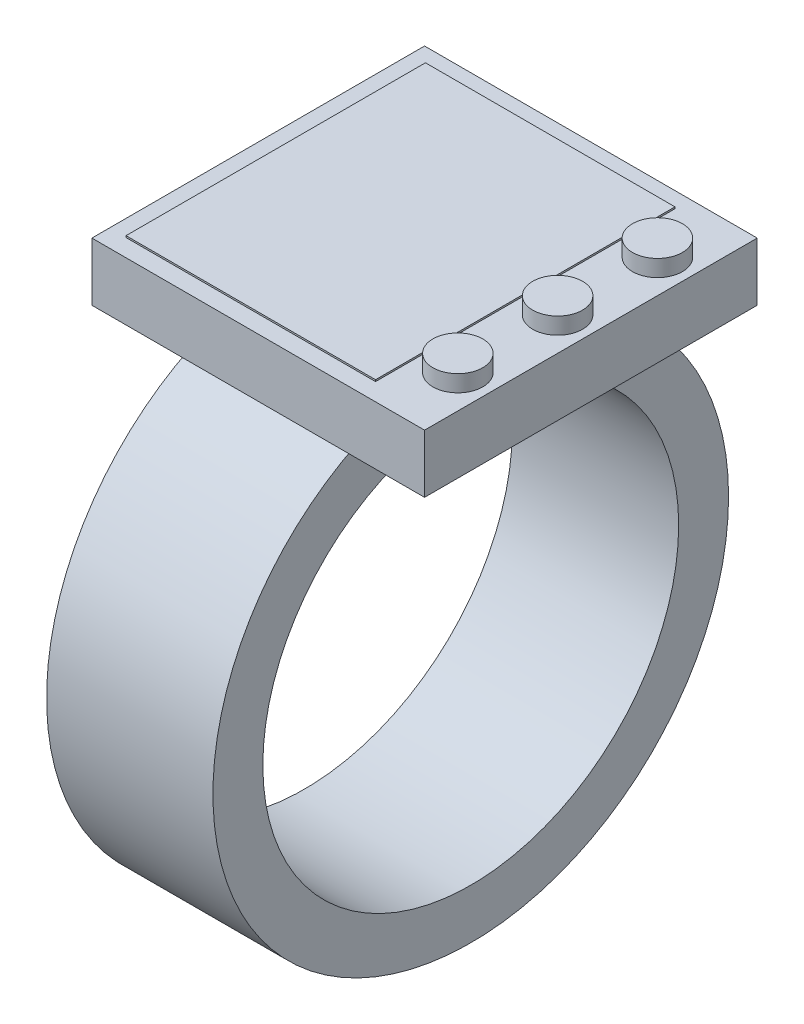
ISO-10303-21;
HEADER;
FILE_DESCRIPTION(('STEP AP214'),'2;1');
FILE_NAME('part.step','',(''),(''),'','','');
FILE_SCHEMA(('AUTOMOTIVE_DESIGN { 1 0 10303 214 1 1 1 1 }'));
ENDSEC;
DATA;
#1=APPLICATION_CONTEXT('core data for automotive mechanical design processes');
#2=APPLICATION_PROTOCOL_DEFINITION('international standard','automotive_design',2000,#1);
#3=PRODUCT_CONTEXT('',#1,'mechanical');
#4=PRODUCT('Part','Part','',(#3));
#5=PRODUCT_RELATED_PRODUCT_CATEGORY('part','',(#4));
#6=PRODUCT_DEFINITION_FORMATION('','',#4);
#7=PRODUCT_DEFINITION_CONTEXT('part definition',#1,'design');
#8=PRODUCT_DEFINITION('design','',#6,#7);
#9=PRODUCT_DEFINITION_SHAPE('','',#8);
#10=(LENGTH_UNIT() NAMED_UNIT(*) SI_UNIT(.MILLI.,.METRE.));
#11=(NAMED_UNIT(*) PLANE_ANGLE_UNIT() SI_UNIT($,.RADIAN.));
#12=(NAMED_UNIT(*) SI_UNIT($,.STERADIAN.) SOLID_ANGLE_UNIT());
#13=UNCERTAINTY_MEASURE_WITH_UNIT(LENGTH_MEASURE(1.E-05),#10,'distance_accuracy_value','');
#14=(GEOMETRIC_REPRESENTATION_CONTEXT(3) GLOBAL_UNCERTAINTY_ASSIGNED_CONTEXT((#13)) GLOBAL_UNIT_ASSIGNED_CONTEXT((#10,
#11,#12)) REPRESENTATION_CONTEXT('',''));
#15=CARTESIAN_POINT('',(0.,0.,0.));
#16=DIRECTION('',(0.,0.,1.));
#17=DIRECTION('',(1.,0.,0.));
#18=AXIS2_PLACEMENT_3D('',#15,#16,#17);
#19=CARTESIAN_POINT('',(-9.10458595575782,48.26,-27.4501922158795));
#20=DIRECTION('',(1.,0.,0.));
#21=DIRECTION('',(0.,0.,-1.));
#22=AXIS2_PLACEMENT_3D('',#19,#20,#21);
#23=PLANE('',#22);
#24=DIRECTION('',(0.,0.,1.));
#25=VECTOR('',#24,1.);
#26=CARTESIAN_POINT('',(-9.10458595575782,39.37,-27.4501922158795));
#27=LINE('',#26,#25);
#28=CARTESIAN_POINT('',(-9.10458595575782,39.37,-27.4501922158795));
#29=VERTEX_POINT('',#28);
#30=CARTESIAN_POINT('',(-9.10458595575782,39.37,23.3498077841205));
#31=VERTEX_POINT('',#30);
#32=EDGE_CURVE('E150',#29,#31,#27,.T.);
#33=ORIENTED_EDGE('',*,*,#32,.T.);
#34=DIRECTION('',(0.,-1.,0.));
#35=VECTOR('',#34,1.);
#36=CARTESIAN_POINT('',(-9.10458595575782,48.26,23.3498077841205));
#37=LINE('',#36,#35);
#38=CARTESIAN_POINT('',(-9.10458595575782,48.26,23.3498077841205));
#39=VERTEX_POINT('',#38);
#40=EDGE_CURVE('E12',#39,#31,#37,.T.);
#41=ORIENTED_EDGE('',*,*,#40,.F.);
#42=DIRECTION('',(0.,0.,1.));
#43=VECTOR('',#42,1.);
#44=CARTESIAN_POINT('',(-9.10458595575782,48.26,-27.4501922158795));
#45=LINE('',#44,#43);
#46=CARTESIAN_POINT('',(-9.10458595575782,48.26,-27.4501922158795));
#47=VERTEX_POINT('',#46);
#48=EDGE_CURVE('E173',#47,#39,#45,.T.);
#49=ORIENTED_EDGE('',*,*,#48,.F.);
#50=DIRECTION('',(0.,-1.,0.));
#51=VECTOR('',#50,1.);
#52=CARTESIAN_POINT('',(-9.10458595575782,48.26,-27.4501922158795));
#53=LINE('',#52,#51);
#54=EDGE_CURVE('E179',#47,#29,#53,.T.);
#55=ORIENTED_EDGE('',*,*,#54,.T.);
#56=EDGE_LOOP('',(#33,#41,#49,#55));
#57=FACE_BOUND('',#56,.T.);
#58=ADVANCED_FACE('F59',(#57),#23,.F.);
#59=CARTESIAN_POINT('',(-9.10458595575782,48.26,23.3498077841205));
#60=DIRECTION('',(0.,0.,-1.));
#61=DIRECTION('',(-1.,0.,0.));
#62=AXIS2_PLACEMENT_3D('',#59,#60,#61);
#63=PLANE('',#62);
#64=DIRECTION('',(1.,0.,0.));
#65=VECTOR('',#64,1.);
#66=CARTESIAN_POINT('',(-9.10458595575782,39.37,23.3498077841205));
#67=LINE('',#66,#65);
#68=CARTESIAN_POINT('',(41.6954140442422,39.37,23.3498077841205));
#69=VERTEX_POINT('',#68);
#70=EDGE_CURVE('E182',#31,#69,#67,.T.);
#71=ORIENTED_EDGE('',*,*,#70,.T.);
#72=DIRECTION('',(0.,-1.,0.));
#73=VECTOR('',#72,1.);
#74=CARTESIAN_POINT('',(41.6954140442422,48.26,23.3498077841205));
#75=LINE('',#74,#73);
#76=CARTESIAN_POINT('',(41.6954140442422,48.26,23.3498077841205));
#77=VERTEX_POINT('',#76);
#78=EDGE_CURVE('E66',#77,#69,#75,.T.);
#79=ORIENTED_EDGE('',*,*,#78,.F.);
#80=DIRECTION('',(1.,0.,0.));
#81=VECTOR('',#80,1.);
#82=CARTESIAN_POINT('',(-9.10458595575782,48.26,23.3498077841205));
#83=LINE('',#82,#81);
#84=EDGE_CURVE('E110',#39,#77,#83,.T.);
#85=ORIENTED_EDGE('',*,*,#84,.F.);
#86=ORIENTED_EDGE('',*,*,#40,.T.);
#87=EDGE_LOOP('',(#71,#79,#85,#86));
#88=FACE_BOUND('',#87,.T.);
#89=ADVANCED_FACE('F212',(#88),#63,.F.);
#90=CARTESIAN_POINT('',(41.6954140442422,48.26,-27.4501922158795));
#91=DIRECTION('',(-1.,0.,0.));
#92=DIRECTION('',(0.,0.,1.));
#93=AXIS2_PLACEMENT_3D('',#90,#91,#92);
#94=PLANE('',#93);
#95=DIRECTION('',(0.,0.,-1.));
#96=VECTOR('',#95,1.);
#97=CARTESIAN_POINT('',(41.6954140442422,39.37,-27.4501922158795));
#98=LINE('',#97,#96);
#99=CARTESIAN_POINT('',(41.6954140442422,39.37,-27.4501922158795));
#100=VERTEX_POINT('',#99);
#101=EDGE_CURVE('E184',#69,#100,#98,.T.);
#102=ORIENTED_EDGE('',*,*,#101,.T.);
#103=DIRECTION('',(0.,-1.,0.));
#104=VECTOR('',#103,1.);
#105=CARTESIAN_POINT('',(41.6954140442422,48.26,-27.4501922158795));
#106=LINE('',#105,#104);
#107=CARTESIAN_POINT('',(41.6954140442422,48.26,-27.4501922158795));
#108=VERTEX_POINT('',#107);
#109=EDGE_CURVE('E188',#108,#100,#106,.T.);
#110=ORIENTED_EDGE('',*,*,#109,.F.);
#111=DIRECTION('',(0.,0.,-1.));
#112=VECTOR('',#111,1.);
#113=CARTESIAN_POINT('',(41.6954140442422,48.26,-27.4501922158795));
#114=LINE('',#113,#112);
#115=EDGE_CURVE('E176',#77,#108,#114,.T.);
#116=ORIENTED_EDGE('',*,*,#115,.F.);
#117=ORIENTED_EDGE('',*,*,#78,.T.);
#118=EDGE_LOOP('',(#102,#110,#116,#117));
#119=FACE_BOUND('',#118,.T.);
#120=ADVANCED_FACE('F193',(#119),#94,.F.);
#121=CARTESIAN_POINT('',(-9.10458595575782,48.26,-27.4501922158795));
#122=DIRECTION('',(0.,0.,1.));
#123=DIRECTION('',(1.,0.,0.));
#124=AXIS2_PLACEMENT_3D('',#121,#122,#123);
#125=PLANE('',#124);
#126=DIRECTION('',(-1.,0.,0.));
#127=VECTOR('',#126,1.);
#128=CARTESIAN_POINT('',(-9.10458595575782,39.37,-27.4501922158795));
#129=LINE('',#128,#127);
#130=EDGE_CURVE('E103',#100,#29,#129,.T.);
#131=ORIENTED_EDGE('',*,*,#130,.T.);
#132=ORIENTED_EDGE('',*,*,#54,.F.);
#133=DIRECTION('',(-1.,0.,0.));
#134=VECTOR('',#133,1.);
#135=CARTESIAN_POINT('',(-9.10458595575782,48.26,-27.4501922158795));
#136=LINE('',#135,#134);
#137=EDGE_CURVE('E82',#108,#47,#136,.T.);
#138=ORIENTED_EDGE('',*,*,#137,.F.);
#139=ORIENTED_EDGE('',*,*,#109,.T.);
#140=EDGE_LOOP('',(#131,#132,#138,#139));
#141=FACE_BOUND('',#140,.T.);
#142=ADVANCED_FACE('F201',(#141),#125,.F.);
#143=CARTESIAN_POINT('',(0.,48.26,0.));
#144=DIRECTION('',(0.,1.,0.));
#145=DIRECTION('',(0.,0.,1.));
#146=AXIS2_PLACEMENT_3D('',#143,#144,#145);
#147=PLANE('',#146);
#148=CARTESIAN_POINT('',(36.6154140442422,48.26,-17.2901922158795));
#149=DIRECTION('',(0.,1.,0.));
#150=DIRECTION('',(0.,0.,1.));
#151=AXIS2_PLACEMENT_3D('',#148,#149,#150);
#152=CIRCLE('',#151,3.81);
#153=CARTESIAN_POINT('',(36.6154140442422,48.26,-13.4801922158795));
#154=VERTEX_POINT('',#153);
#155=EDGE_CURVE('E394',#154,#154,#152,.T.);
#156=ORIENTED_EDGE('',*,*,#155,.F.);
#157=EDGE_LOOP('',(#156));
#158=FACE_BOUND('',#157,.T.);
#159=CARTESIAN_POINT('',(36.6154140442422,48.26,13.1898077841205));
#160=DIRECTION('',(0.,1.,0.));
#161=DIRECTION('',(0.,0.,1.));
#162=AXIS2_PLACEMENT_3D('',#159,#160,#161);
#163=CIRCLE('',#162,3.81);
#164=CARTESIAN_POINT('',(36.6154140442422,48.26,16.9998077841205));
#165=VERTEX_POINT('',#164);
#166=EDGE_CURVE('E397',#165,#165,#163,.T.);
#167=ORIENTED_EDGE('',*,*,#166,.F.);
#168=EDGE_LOOP('',(#167));
#169=FACE_BOUND('',#168,.T.);
#170=CARTESIAN_POINT('',(36.6154140442422,48.26,-2.05019221587949));
#171=DIRECTION('',(0.,1.,0.));
#172=DIRECTION('',(0.,0.,1.));
#173=AXIS2_PLACEMENT_3D('',#170,#171,#172);
#174=CIRCLE('',#173,3.81);
#175=CARTESIAN_POINT('',(36.6154140442422,48.26,1.75980778412051));
#176=VERTEX_POINT('',#175);
#177=EDGE_CURVE('E405',#176,#176,#174,.T.);
#178=ORIENTED_EDGE('',*,*,#177,.F.);
#179=EDGE_LOOP('',(#178));
#180=FACE_BOUND('',#179,.T.);
#181=DIRECTION('',(1.,0.,0.));
#182=VECTOR('',#181,1.);
#183=CARTESIAN_POINT('',(-6.56458595575782,48.26,20.6754647037333));
#184=LINE('',#183,#182);
#185=CARTESIAN_POINT('',(-6.56458595575782,48.26,20.6754647037333));
#186=VERTEX_POINT('',#185);
#187=CARTESIAN_POINT('',(31.5354140442422,48.26,20.6754647037333));
#188=VERTEX_POINT('',#187);
#189=EDGE_CURVE('E73',#186,#188,#184,.T.);
#190=ORIENTED_EDGE('',*,*,#189,.F.);
#191=DIRECTION('',(0.,0.,1.));
#192=VECTOR('',#191,1.);
#193=CARTESIAN_POINT('',(-6.56458595575782,48.26,-25.0445352962667));
#194=LINE('',#193,#192);
#195=CARTESIAN_POINT('',(-6.56458595575782,48.26,-25.0445352962667));
#196=VERTEX_POINT('',#195);
#197=EDGE_CURVE('E143',#196,#186,#194,.T.);
#198=ORIENTED_EDGE('',*,*,#197,.F.);
#199=DIRECTION('',(1.,0.,0.));
#200=VECTOR('',#199,1.);
#201=CARTESIAN_POINT('',(-6.56458595575782,48.26,-25.0445352962667));
#202=LINE('',#201,#200);
#203=CARTESIAN_POINT('',(31.5354140442422,48.26,-25.0445352962667));
#204=VERTEX_POINT('',#203);
#205=EDGE_CURVE('E165',#196,#204,#202,.T.);
#206=ORIENTED_EDGE('',*,*,#205,.T.);
#207=DIRECTION('',(0.,0.,1.));
#208=VECTOR('',#207,1.);
#209=CARTESIAN_POINT('',(31.5354140442422,48.26,-25.0445352962667));
#210=LINE('',#209,#208);
#211=EDGE_CURVE('E162',#204,#188,#210,.T.);
#212=ORIENTED_EDGE('',*,*,#211,.T.);
#213=EDGE_LOOP('',(#190,#198,#206,#212));
#214=FACE_BOUND('',#213,.T.);
#215=ORIENTED_EDGE('',*,*,#48,.T.);
#216=ORIENTED_EDGE('',*,*,#84,.T.);
#217=ORIENTED_EDGE('',*,*,#115,.T.);
#218=ORIENTED_EDGE('',*,*,#137,.T.);
#219=EDGE_LOOP('',(#215,#216,#217,#218));
#220=FACE_BOUND('',#219,.T.);
#221=ADVANCED_FACE('F203',(#158,#169,#180,#214,#220),#147,.T.);
#222=CARTESIAN_POINT('',(0.,39.37,0.));
#223=DIRECTION('',(0.,1.,0.));
#224=DIRECTION('',(0.,0.,1.));
#225=AXIS2_PLACEMENT_3D('',#222,#223,#224);
#226=PLANE('',#225);
#227=ORIENTED_EDGE('',*,*,#32,.F.);
#228=ORIENTED_EDGE('',*,*,#130,.F.);
#229=ORIENTED_EDGE('',*,*,#101,.F.);
#230=ORIENTED_EDGE('',*,*,#70,.F.);
#231=EDGE_LOOP('',(#227,#228,#229,#230));
#232=FACE_BOUND('',#231,.T.);
#233=ADVANCED_FACE('F197',(#232),#226,.F.);
#234=CARTESIAN_POINT('',(-6.56458595575782,48.514,20.6754647037333));
#235=DIRECTION('',(0.,0.,-1.));
#236=DIRECTION('',(-1.,0.,0.));
#237=AXIS2_PLACEMENT_3D('',#234,#235,#236);
#238=PLANE('',#237);
#239=ORIENTED_EDGE('',*,*,#189,.T.);
#240=DIRECTION('',(0.,-1.,0.));
#241=VECTOR('',#240,1.);
#242=CARTESIAN_POINT('',(31.5354140442422,48.514,20.6754647037333));
#243=LINE('',#242,#241);
#244=CARTESIAN_POINT('',(31.5354140442422,48.514,20.6754647037333));
#245=VERTEX_POINT('',#244);
#246=EDGE_CURVE('E145',#245,#188,#243,.T.);
#247=ORIENTED_EDGE('',*,*,#246,.F.);
#248=DIRECTION('',(1.,0.,0.));
#249=VECTOR('',#248,1.);
#250=CARTESIAN_POINT('',(-6.56458595575782,48.514,20.6754647037333));
#251=LINE('',#250,#249);
#252=CARTESIAN_POINT('',(-6.56458595575782,48.514,20.6754647037333));
#253=VERTEX_POINT('',#252);
#254=EDGE_CURVE('E134',#253,#245,#251,.T.);
#255=ORIENTED_EDGE('',*,*,#254,.F.);
#256=DIRECTION('',(0.,-1.,0.));
#257=VECTOR('',#256,1.);
#258=CARTESIAN_POINT('',(-6.56458595575782,48.514,20.6754647037333));
#259=LINE('',#258,#257);
#260=EDGE_CURVE('E160',#253,#186,#259,.T.);
#261=ORIENTED_EDGE('',*,*,#260,.T.);
#262=EDGE_LOOP('',(#239,#247,#255,#261));
#263=FACE_BOUND('',#262,.T.);
#264=ADVANCED_FACE('F146',(#263),#238,.F.);
#265=CARTESIAN_POINT('',(31.5354140442422,48.514,-25.0445352962667));
#266=DIRECTION('',(1.,0.,0.));
#267=DIRECTION('',(0.,0.,-1.));
#268=AXIS2_PLACEMENT_3D('',#265,#266,#267);
#269=PLANE('',#268);
#270=ORIENTED_EDGE('',*,*,#211,.F.);
#271=DIRECTION('',(0.,-1.,0.));
#272=VECTOR('',#271,1.);
#273=CARTESIAN_POINT('',(31.5354140442422,48.514,-25.0445352962667));
#274=LINE('',#273,#272);
#275=CARTESIAN_POINT('',(31.5354140442422,48.514,-25.0445352962667));
#276=VERTEX_POINT('',#275);
#277=EDGE_CURVE('E151',#276,#204,#274,.T.);
#278=ORIENTED_EDGE('',*,*,#277,.F.);
#279=DIRECTION('',(0.,0.,1.));
#280=VECTOR('',#279,1.);
#281=CARTESIAN_POINT('',(31.5354140442422,48.514,-25.0445352962667));
#282=LINE('',#281,#280);
#283=EDGE_CURVE('E138',#276,#245,#282,.T.);
#284=ORIENTED_EDGE('',*,*,#283,.T.);
#285=ORIENTED_EDGE('',*,*,#246,.T.);
#286=EDGE_LOOP('',(#270,#278,#284,#285));
#287=FACE_BOUND('',#286,.T.);
#288=ADVANCED_FACE('F153',(#287),#269,.T.);
#289=CARTESIAN_POINT('',(-6.56458595575782,48.514,-25.0445352962667));
#290=DIRECTION('',(0.,0.,-1.));
#291=DIRECTION('',(-1.,0.,0.));
#292=AXIS2_PLACEMENT_3D('',#289,#290,#291);
#293=PLANE('',#292);
#294=ORIENTED_EDGE('',*,*,#205,.F.);
#295=DIRECTION('',(0.,-1.,0.));
#296=VECTOR('',#295,1.);
#297=CARTESIAN_POINT('',(-6.56458595575782,48.514,-25.0445352962667));
#298=LINE('',#297,#296);
#299=CARTESIAN_POINT('',(-6.56458595575782,48.514,-25.0445352962667));
#300=VERTEX_POINT('',#299);
#301=EDGE_CURVE('E170',#300,#196,#298,.T.);
#302=ORIENTED_EDGE('',*,*,#301,.F.);
#303=DIRECTION('',(1.,0.,0.));
#304=VECTOR('',#303,1.);
#305=CARTESIAN_POINT('',(-6.56458595575782,48.514,-25.0445352962667));
#306=LINE('',#305,#304);
#307=EDGE_CURVE('E154',#300,#276,#306,.T.);
#308=ORIENTED_EDGE('',*,*,#307,.T.);
#309=ORIENTED_EDGE('',*,*,#277,.T.);
#310=EDGE_LOOP('',(#294,#302,#308,#309));
#311=FACE_BOUND('',#310,.T.);
#312=ADVANCED_FACE('F262',(#311),#293,.T.);
#313=CARTESIAN_POINT('',(-6.56458595575782,48.514,-25.0445352962667));
#314=DIRECTION('',(1.,0.,0.));
#315=DIRECTION('',(0.,0.,-1.));
#316=AXIS2_PLACEMENT_3D('',#313,#314,#315);
#317=PLANE('',#316);
#318=ORIENTED_EDGE('',*,*,#197,.T.);
#319=ORIENTED_EDGE('',*,*,#260,.F.);
#320=DIRECTION('',(0.,0.,1.));
#321=VECTOR('',#320,1.);
#322=CARTESIAN_POINT('',(-6.56458595575782,48.514,-25.0445352962667));
#323=LINE('',#322,#321);
#324=EDGE_CURVE('E141',#300,#253,#323,.T.);
#325=ORIENTED_EDGE('',*,*,#324,.F.);
#326=ORIENTED_EDGE('',*,*,#301,.T.);
#327=EDGE_LOOP('',(#318,#319,#325,#326));
#328=FACE_BOUND('',#327,.T.);
#329=ADVANCED_FACE('F271',(#328),#317,.F.);
#330=CARTESIAN_POINT('',(0.,48.514,0.));
#331=DIRECTION('',(0.,-1.,0.));
#332=DIRECTION('',(0.,0.,-1.));
#333=AXIS2_PLACEMENT_3D('',#330,#331,#332);
#334=PLANE('',#333);
#335=ORIENTED_EDGE('',*,*,#254,.T.);
#336=ORIENTED_EDGE('',*,*,#283,.F.);
#337=ORIENTED_EDGE('',*,*,#307,.F.);
#338=ORIENTED_EDGE('',*,*,#324,.T.);
#339=EDGE_LOOP('',(#335,#336,#337,#338));
#340=FACE_BOUND('',#339,.T.);
#341=ADVANCED_FACE('F135',(#340),#334,.F.);
#342=CARTESIAN_POINT('',(36.6154140442422,50.8,-2.05019221587949));
#343=DIRECTION('',(0.,-1.,0.));
#344=DIRECTION('',(0.,0.,-1.));
#345=AXIS2_PLACEMENT_3D('',#342,#343,#344);
#346=CYLINDRICAL_SURFACE('',#345,3.81);
#347=CARTESIAN_POINT('',(36.6154140442422,50.8,-2.05019221587949));
#348=DIRECTION('',(0.,1.,0.));
#349=DIRECTION('',(0.,0.,1.));
#350=AXIS2_PLACEMENT_3D('',#347,#348,#349);
#351=CIRCLE('',#350,3.81);
#352=CARTESIAN_POINT('',(36.6154140442422,50.8,1.75980778412051));
#353=VERTEX_POINT('',#352);
#354=EDGE_CURVE('E407',#353,#353,#351,.T.);
#355=ORIENTED_EDGE('',*,*,#354,.F.);
#356=EDGE_LOOP('',(#355));
#357=FACE_BOUND('',#356,.T.);
#358=ORIENTED_EDGE('',*,*,#177,.T.);
#359=EDGE_LOOP('',(#358));
#360=FACE_BOUND('',#359,.T.);
#361=ADVANCED_FACE('F290',(#357,#360),#346,.T.);
#362=CARTESIAN_POINT('',(36.6154140442422,50.8,-2.05019221587949));
#363=DIRECTION('',(0.,1.,0.));
#364=DIRECTION('',(0.,0.,1.));
#365=AXIS2_PLACEMENT_3D('',#362,#363,#364);
#366=PLANE('',#365);
#367=ORIENTED_EDGE('',*,*,#354,.T.);
#368=EDGE_LOOP('',(#367));
#369=FACE_BOUND('',#368,.T.);
#370=ADVANCED_FACE('F300',(#369),#366,.T.);
#371=CARTESIAN_POINT('',(36.6154140442422,50.8,13.1898077841205));
#372=DIRECTION('',(0.,-1.,0.));
#373=DIRECTION('',(0.,0.,-1.));
#374=AXIS2_PLACEMENT_3D('',#371,#372,#373);
#375=CYLINDRICAL_SURFACE('',#374,3.81);
#376=CARTESIAN_POINT('',(36.6154140442422,50.8,13.1898077841205));
#377=DIRECTION('',(0.,1.,0.));
#378=DIRECTION('',(0.,0.,1.));
#379=AXIS2_PLACEMENT_3D('',#376,#377,#378);
#380=CIRCLE('',#379,3.81);
#381=CARTESIAN_POINT('',(36.6154140442422,50.8,16.9998077841205));
#382=VERTEX_POINT('',#381);
#383=EDGE_CURVE('E402',#382,#382,#380,.T.);
#384=ORIENTED_EDGE('',*,*,#383,.F.);
#385=EDGE_LOOP('',(#384));
#386=FACE_BOUND('',#385,.T.);
#387=ORIENTED_EDGE('',*,*,#166,.T.);
#388=EDGE_LOOP('',(#387));
#389=FACE_BOUND('',#388,.T.);
#390=ADVANCED_FACE('F312',(#386,#389),#375,.T.);
#391=CARTESIAN_POINT('',(36.6154140442422,50.8,13.1898077841205));
#392=DIRECTION('',(0.,1.,0.));
#393=DIRECTION('',(0.,0.,1.));
#394=AXIS2_PLACEMENT_3D('',#391,#392,#393);
#395=PLANE('',#394);
#396=ORIENTED_EDGE('',*,*,#383,.T.);
#397=EDGE_LOOP('',(#396));
#398=FACE_BOUND('',#397,.T.);
#399=ADVANCED_FACE('F324',(#398),#395,.T.);
#400=CARTESIAN_POINT('',(36.6154140442422,50.8,-17.2901922158795));
#401=DIRECTION('',(0.,-1.,0.));
#402=DIRECTION('',(0.,0.,-1.));
#403=AXIS2_PLACEMENT_3D('',#400,#401,#402);
#404=CYLINDRICAL_SURFACE('',#403,3.81);
#405=CARTESIAN_POINT('',(36.6154140442422,50.8,-17.2901922158795));
#406=DIRECTION('',(0.,1.,0.));
#407=DIRECTION('',(0.,0.,1.));
#408=AXIS2_PLACEMENT_3D('',#405,#406,#407);
#409=CIRCLE('',#408,3.81);
#410=CARTESIAN_POINT('',(36.6154140442422,50.8,-13.4801922158795));
#411=VERTEX_POINT('',#410);
#412=EDGE_CURVE('E163',#411,#411,#409,.T.);
#413=ORIENTED_EDGE('',*,*,#412,.F.);
#414=EDGE_LOOP('',(#413));
#415=FACE_BOUND('',#414,.T.);
#416=ORIENTED_EDGE('',*,*,#155,.T.);
#417=EDGE_LOOP('',(#416));
#418=FACE_BOUND('',#417,.T.);
#419=ADVANCED_FACE('F336',(#415,#418),#404,.T.);
#420=CARTESIAN_POINT('',(36.6154140442422,50.8,-17.2901922158795));
#421=DIRECTION('',(0.,1.,0.));
#422=DIRECTION('',(0.,0.,1.));
#423=AXIS2_PLACEMENT_3D('',#420,#421,#422);
#424=PLANE('',#423);
#425=ORIENTED_EDGE('',*,*,#412,.T.);
#426=EDGE_LOOP('',(#425));
#427=FACE_BOUND('',#426,.T.);
#428=ADVANCED_FACE('F348',(#427),#424,.T.);
#429=CLOSED_SHELL('',(#58,#89,#120,#142,#221,#233,#264,#288,#312,#329,#341,#361,#370,#390,#399,
#419,#428));
#430=MANIFOLD_SOLID_BREP('B2',#429);
#431=CARTESIAN_POINT('',(25.4,0.,0.));
#432=DIRECTION('',(1.,0.,0.));
#433=DIRECTION('',(0.,0.,-1.));
#434=AXIS2_PLACEMENT_3D('',#431,#432,#433);
#435=PLANE('',#434);
#436=CARTESIAN_POINT('',(25.4,0.,0.));
#437=DIRECTION('',(1.,0.,0.));
#438=DIRECTION('',(0.,0.,-1.));
#439=AXIS2_PLACEMENT_3D('',#436,#437,#438);
#440=CIRCLE('',#439,39.37);
#441=CARTESIAN_POINT('',(25.4,0.,-39.37));
#442=VERTEX_POINT('',#441);
#443=EDGE_CURVE('E58',#442,#442,#440,.T.);
#444=ORIENTED_EDGE('',*,*,#443,.T.);
#445=EDGE_LOOP('',(#444));
#446=FACE_BOUND('',#445,.T.);
#447=CARTESIAN_POINT('',(25.4,0.,0.));
#448=DIRECTION('',(1.,0.,0.));
#449=DIRECTION('',(0.,0.,-1.));
#450=AXIS2_PLACEMENT_3D('',#447,#448,#449);
#451=CIRCLE('',#450,31.75);
#452=CARTESIAN_POINT('',(25.4,0.,-31.75));
#453=VERTEX_POINT('',#452);
#454=EDGE_CURVE('E443',#453,#453,#451,.T.);
#455=ORIENTED_EDGE('',*,*,#454,.F.);
#456=EDGE_LOOP('',(#455));
#457=FACE_BOUND('',#456,.T.);
#458=ADVANCED_FACE('F430',(#446,#457),#435,.T.);
#459=CARTESIAN_POINT('',(0.,0.,0.));
#460=DIRECTION('',(1.,0.,0.));
#461=DIRECTION('',(0.,0.,-1.));
#462=AXIS2_PLACEMENT_3D('',#459,#460,#461);
#463=PLANE('',#462);
#464=CARTESIAN_POINT('',(0.,0.,0.));
#465=DIRECTION('',(1.,0.,0.));
#466=DIRECTION('',(0.,0.,-1.));
#467=AXIS2_PLACEMENT_3D('',#464,#465,#466);
#468=CIRCLE('',#467,39.37);
#469=CARTESIAN_POINT('',(0.,0.,-39.37));
#470=VERTEX_POINT('',#469);
#471=EDGE_CURVE('E434',#470,#470,#468,.T.);
#472=ORIENTED_EDGE('',*,*,#471,.F.);
#473=EDGE_LOOP('',(#472));
#474=FACE_BOUND('',#473,.T.);
#475=CARTESIAN_POINT('',(0.,0.,0.));
#476=DIRECTION('',(1.,0.,0.));
#477=DIRECTION('',(0.,0.,-1.));
#478=AXIS2_PLACEMENT_3D('',#475,#476,#477);
#479=CIRCLE('',#478,31.75);
#480=CARTESIAN_POINT('',(0.,0.,-31.75));
#481=VERTEX_POINT('',#480);
#482=EDGE_CURVE('E445',#481,#481,#479,.T.);
#483=ORIENTED_EDGE('',*,*,#482,.T.);
#484=EDGE_LOOP('',(#483));
#485=FACE_BOUND('',#484,.T.);
#486=ADVANCED_FACE('F457',(#474,#485),#463,.F.);
#487=CARTESIAN_POINT('',(25.4,0.,0.));
#488=DIRECTION('',(-1.,0.,0.));
#489=DIRECTION('',(0.,0.,1.));
#490=AXIS2_PLACEMENT_3D('',#487,#488,#489);
#491=CYLINDRICAL_SURFACE('',#490,39.37);
#492=ORIENTED_EDGE('',*,*,#471,.T.);
#493=EDGE_LOOP('',(#492));
#494=FACE_BOUND('',#493,.T.);
#495=ORIENTED_EDGE('',*,*,#443,.F.);
#496=EDGE_LOOP('',(#495));
#497=FACE_BOUND('',#496,.T.);
#498=ADVANCED_FACE('F432',(#494,#497),#491,.T.);
#499=CARTESIAN_POINT('',(25.4,0.,0.));
#500=DIRECTION('',(-1.,0.,0.));
#501=DIRECTION('',(0.,0.,1.));
#502=AXIS2_PLACEMENT_3D('',#499,#500,#501);
#503=CYLINDRICAL_SURFACE('',#502,31.75);
#504=ORIENTED_EDGE('',*,*,#454,.T.);
#505=EDGE_LOOP('',(#504));
#506=FACE_BOUND('',#505,.T.);
#507=ORIENTED_EDGE('',*,*,#482,.F.);
#508=EDGE_LOOP('',(#507));
#509=FACE_BOUND('',#508,.T.);
#510=ADVANCED_FACE('F453',(#506,#509),#503,.F.);
#511=CLOSED_SHELL('',(#458,#486,#498,#510));
#512=MANIFOLD_SOLID_BREP('B6',#511);
#513=ADVANCED_BREP_SHAPE_REPRESENTATION('',(#18,#430,#512),#14);
#514=SHAPE_DEFINITION_REPRESENTATION(#9,#513);
ENDSEC;
END-ISO-10303-21;
